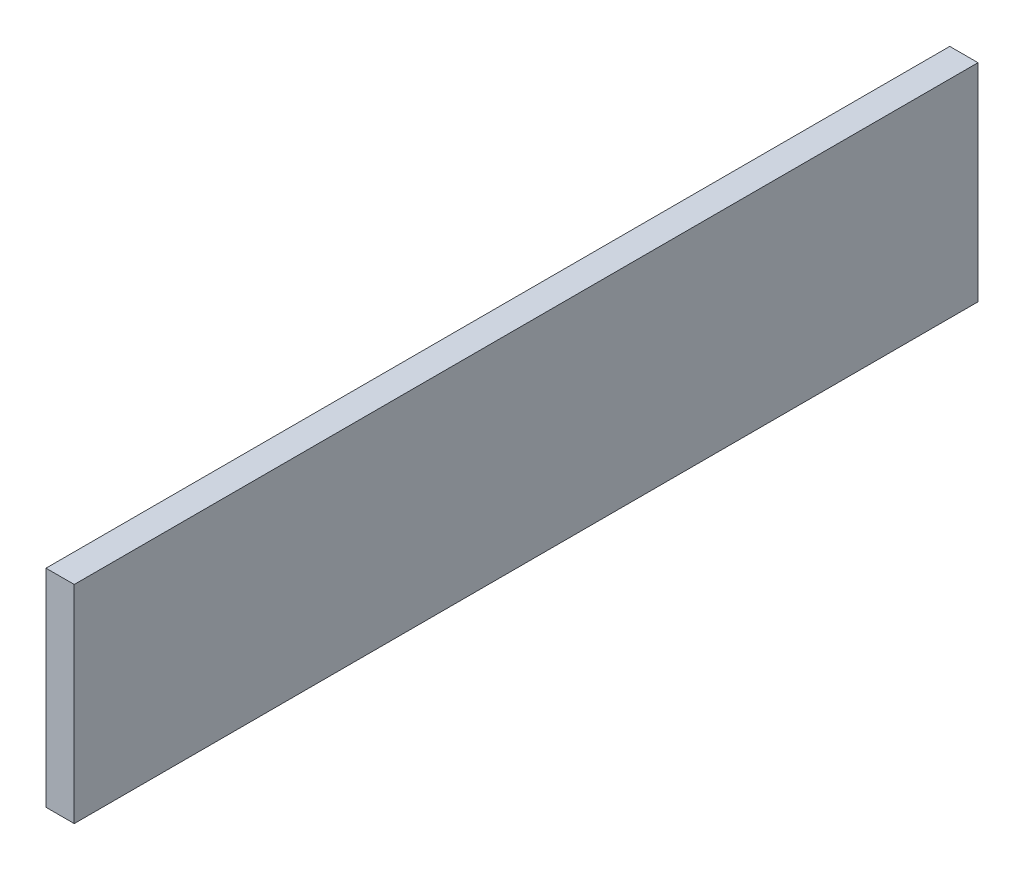
ISO-10303-21;
HEADER;
FILE_DESCRIPTION(('STEP AP214'),'2;1');
FILE_NAME('part.step','',(''),(''),'','','');
FILE_SCHEMA(('AUTOMOTIVE_DESIGN { 1 0 10303 214 1 1 1 1 }'));
ENDSEC;
DATA;
#1=APPLICATION_CONTEXT('core data for automotive mechanical design processes');
#2=APPLICATION_PROTOCOL_DEFINITION('international standard','automotive_design',2000,#1);
#3=PRODUCT_CONTEXT('',#1,'mechanical');
#4=PRODUCT('Part','Part','',(#3));
#5=PRODUCT_RELATED_PRODUCT_CATEGORY('part','',(#4));
#6=PRODUCT_DEFINITION_FORMATION('','',#4);
#7=PRODUCT_DEFINITION_CONTEXT('part definition',#1,'design');
#8=PRODUCT_DEFINITION('design','',#6,#7);
#9=PRODUCT_DEFINITION_SHAPE('','',#8);
#10=(LENGTH_UNIT() NAMED_UNIT(*) SI_UNIT(.MILLI.,.METRE.));
#11=(NAMED_UNIT(*) PLANE_ANGLE_UNIT() SI_UNIT($,.RADIAN.));
#12=(NAMED_UNIT(*) SI_UNIT($,.STERADIAN.) SOLID_ANGLE_UNIT());
#13=UNCERTAINTY_MEASURE_WITH_UNIT(LENGTH_MEASURE(1.E-05),#10,'distance_accuracy_value','');
#14=(GEOMETRIC_REPRESENTATION_CONTEXT(3) GLOBAL_UNCERTAINTY_ASSIGNED_CONTEXT((#13)) GLOBAL_UNIT_ASSIGNED_CONTEXT((#10,
#11,#12)) REPRESENTATION_CONTEXT('',''));
#15=CARTESIAN_POINT('',(0.,0.,0.));
#16=DIRECTION('',(0.,0.,1.));
#17=DIRECTION('',(1.,0.,0.));
#18=AXIS2_PLACEMENT_3D('',#15,#16,#17);
#19=CARTESIAN_POINT('',(19.05,0.,0.));
#20=DIRECTION('',(0.,0.,-1.));
#21=DIRECTION('',(-1.,0.,0.));
#22=AXIS2_PLACEMENT_3D('',#19,#20,#21);
#23=PLANE('',#22);
#24=DIRECTION('',(0.,-1.,0.));
#25=VECTOR('',#24,1.);
#26=CARTESIAN_POINT('',(0.,0.,0.));
#27=LINE('',#26,#25);
#28=CARTESIAN_POINT('',(0.,139.7,0.));
#29=VERTEX_POINT('',#28);
#30=CARTESIAN_POINT('',(0.,0.,0.));
#31=VERTEX_POINT('',#30);
#32=EDGE_CURVE('E111',#29,#31,#27,.T.);
#33=ORIENTED_EDGE('',*,*,#32,.T.);
#34=DIRECTION('',(-1.,0.,0.));
#35=VECTOR('',#34,1.);
#36=CARTESIAN_POINT('',(19.05,0.,0.));
#37=LINE('',#36,#35);
#38=CARTESIAN_POINT('',(19.05,0.,0.));
#39=VERTEX_POINT('',#38);
#40=EDGE_CURVE('E11',#39,#31,#37,.T.);
#41=ORIENTED_EDGE('',*,*,#40,.F.);
#42=DIRECTION('',(0.,-1.,0.));
#43=VECTOR('',#42,1.);
#44=CARTESIAN_POINT('',(19.05,0.,0.));
#45=LINE('',#44,#43);
#46=CARTESIAN_POINT('',(19.05,139.7,0.));
#47=VERTEX_POINT('',#46);
#48=EDGE_CURVE('E95',#47,#39,#45,.T.);
#49=ORIENTED_EDGE('',*,*,#48,.F.);
#50=DIRECTION('',(-1.,0.,0.));
#51=VECTOR('',#50,1.);
#52=CARTESIAN_POINT('',(19.05,139.7,0.));
#53=LINE('',#52,#51);
#54=EDGE_CURVE('E107',#47,#29,#53,.T.);
#55=ORIENTED_EDGE('',*,*,#54,.T.);
#56=EDGE_LOOP('',(#33,#41,#49,#55));
#57=FACE_BOUND('',#56,.T.);
#58=ADVANCED_FACE('F43',(#57),#23,.F.);
#59=CARTESIAN_POINT('',(19.05,0.,0.));
#60=DIRECTION('',(0.,1.,0.));
#61=DIRECTION('',(0.,0.,1.));
#62=AXIS2_PLACEMENT_3D('',#59,#60,#61);
#63=PLANE('',#62);
#64=DIRECTION('',(0.,0.,-1.));
#65=VECTOR('',#64,1.);
#66=CARTESIAN_POINT('',(0.,0.,0.));
#67=LINE('',#66,#65);
#68=CARTESIAN_POINT('',(0.,0.,-609.6));
#69=VERTEX_POINT('',#68);
#70=EDGE_CURVE('E100',#31,#69,#67,.T.);
#71=ORIENTED_EDGE('',*,*,#70,.T.);
#72=DIRECTION('',(-1.,0.,0.));
#73=VECTOR('',#72,1.);
#74=CARTESIAN_POINT('',(19.05,0.,-609.6));
#75=LINE('',#74,#73);
#76=CARTESIAN_POINT('',(19.05,0.,-609.6));
#77=VERTEX_POINT('',#76);
#78=EDGE_CURVE('E52',#77,#69,#75,.T.);
#79=ORIENTED_EDGE('',*,*,#78,.F.);
#80=DIRECTION('',(0.,0.,-1.));
#81=VECTOR('',#80,1.);
#82=CARTESIAN_POINT('',(19.05,0.,0.));
#83=LINE('',#82,#81);
#84=EDGE_CURVE('E90',#39,#77,#83,.T.);
#85=ORIENTED_EDGE('',*,*,#84,.F.);
#86=ORIENTED_EDGE('',*,*,#40,.T.);
#87=EDGE_LOOP('',(#71,#79,#85,#86));
#88=FACE_BOUND('',#87,.T.);
#89=ADVANCED_FACE('F99',(#88),#63,.F.);
#90=CARTESIAN_POINT('',(19.05,0.,-609.6));
#91=DIRECTION('',(0.,0.,1.));
#92=DIRECTION('',(1.,0.,0.));
#93=AXIS2_PLACEMENT_3D('',#90,#91,#92);
#94=PLANE('',#93);
#95=DIRECTION('',(0.,1.,0.));
#96=VECTOR('',#95,1.);
#97=CARTESIAN_POINT('',(0.,0.,-609.6));
#98=LINE('',#97,#96);
#99=CARTESIAN_POINT('',(0.,139.7,-609.6));
#100=VERTEX_POINT('',#99);
#101=EDGE_CURVE('E77',#69,#100,#98,.T.);
#102=ORIENTED_EDGE('',*,*,#101,.T.);
#103=DIRECTION('',(-1.,0.,0.));
#104=VECTOR('',#103,1.);
#105=CARTESIAN_POINT('',(19.05,139.7,-609.6));
#106=LINE('',#105,#104);
#107=CARTESIAN_POINT('',(19.05,139.7,-609.6));
#108=VERTEX_POINT('',#107);
#109=EDGE_CURVE('E102',#108,#100,#106,.T.);
#110=ORIENTED_EDGE('',*,*,#109,.F.);
#111=DIRECTION('',(0.,1.,0.));
#112=VECTOR('',#111,1.);
#113=CARTESIAN_POINT('',(19.05,0.,-609.6));
#114=LINE('',#113,#112);
#115=EDGE_CURVE('E93',#77,#108,#114,.T.);
#116=ORIENTED_EDGE('',*,*,#115,.F.);
#117=ORIENTED_EDGE('',*,*,#78,.T.);
#118=EDGE_LOOP('',(#102,#110,#116,#117));
#119=FACE_BOUND('',#118,.T.);
#120=ADVANCED_FACE('F103',(#119),#94,.F.);
#121=CARTESIAN_POINT('',(19.05,139.7,0.));
#122=DIRECTION('',(0.,-1.,0.));
#123=DIRECTION('',(0.,0.,-1.));
#124=AXIS2_PLACEMENT_3D('',#121,#122,#123);
#125=PLANE('',#124);
#126=DIRECTION('',(0.,0.,1.));
#127=VECTOR('',#126,1.);
#128=CARTESIAN_POINT('',(0.,139.7,0.));
#129=LINE('',#128,#127);
#130=EDGE_CURVE('E83',#100,#29,#129,.T.);
#131=ORIENTED_EDGE('',*,*,#130,.T.);
#132=ORIENTED_EDGE('',*,*,#54,.F.);
#133=DIRECTION('',(0.,0.,1.));
#134=VECTOR('',#133,1.);
#135=CARTESIAN_POINT('',(19.05,139.7,0.));
#136=LINE('',#135,#134);
#137=EDGE_CURVE('E60',#108,#47,#136,.T.);
#138=ORIENTED_EDGE('',*,*,#137,.F.);
#139=ORIENTED_EDGE('',*,*,#109,.T.);
#140=EDGE_LOOP('',(#131,#132,#138,#139));
#141=FACE_BOUND('',#140,.T.);
#142=ADVANCED_FACE('F124',(#141),#125,.F.);
#143=CARTESIAN_POINT('',(19.05,0.,0.));
#144=DIRECTION('',(-1.,0.,0.));
#145=DIRECTION('',(0.,0.,1.));
#146=AXIS2_PLACEMENT_3D('',#143,#144,#145);
#147=PLANE('',#146);
#148=ORIENTED_EDGE('',*,*,#48,.T.);
#149=ORIENTED_EDGE('',*,*,#84,.T.);
#150=ORIENTED_EDGE('',*,*,#115,.T.);
#151=ORIENTED_EDGE('',*,*,#137,.T.);
#152=EDGE_LOOP('',(#148,#149,#150,#151));
#153=FACE_BOUND('',#152,.T.);
#154=ADVANCED_FACE('F91',(#153),#147,.F.);
#155=CARTESIAN_POINT('',(0.,0.,0.));
#156=DIRECTION('',(-1.,0.,0.));
#157=DIRECTION('',(0.,0.,1.));
#158=AXIS2_PLACEMENT_3D('',#155,#156,#157);
#159=PLANE('',#158);
#160=ORIENTED_EDGE('',*,*,#32,.F.);
#161=ORIENTED_EDGE('',*,*,#130,.F.);
#162=ORIENTED_EDGE('',*,*,#101,.F.);
#163=ORIENTED_EDGE('',*,*,#70,.F.);
#164=EDGE_LOOP('',(#160,#161,#162,#163));
#165=FACE_BOUND('',#164,.T.);
#166=ADVANCED_FACE('F127',(#165),#159,.T.);
#167=CLOSED_SHELL('',(#58,#89,#120,#142,#154,#166));
#168=MANIFOLD_SOLID_BREP('B2',#167);
#169=ADVANCED_BREP_SHAPE_REPRESENTATION('',(#18,#168),#14);
#170=SHAPE_DEFINITION_REPRESENTATION(#9,#169);
ENDSEC;
END-ISO-10303-21;
